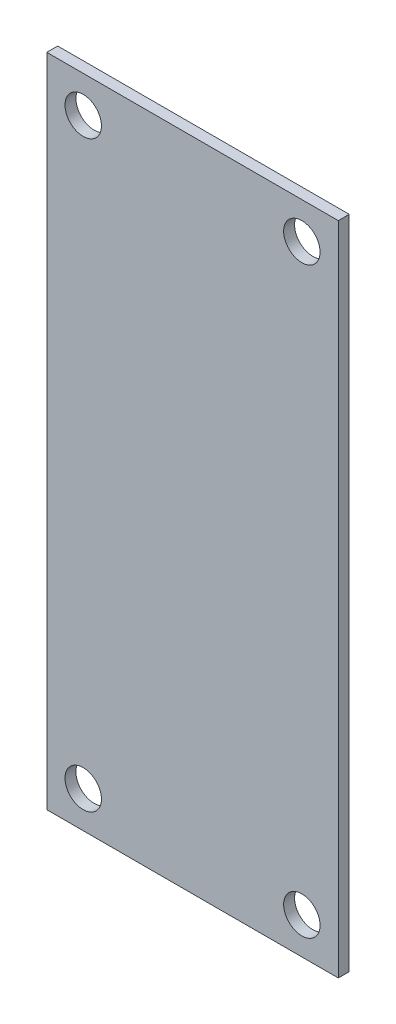
ISO-10303-21;
HEADER;
FILE_DESCRIPTION(('STEP AP214'),'2;1');
FILE_NAME('part.step','',(''),(''),'','','');
FILE_SCHEMA(('AUTOMOTIVE_DESIGN { 1 0 10303 214 1 1 1 1 }'));
ENDSEC;
DATA;
#1=APPLICATION_CONTEXT('core data for automotive mechanical design processes');
#2=APPLICATION_PROTOCOL_DEFINITION('international standard','automotive_design',2000,#1);
#3=PRODUCT_CONTEXT('',#1,'mechanical');
#4=PRODUCT('Part','Part','',(#3));
#5=PRODUCT_RELATED_PRODUCT_CATEGORY('part','',(#4));
#6=PRODUCT_DEFINITION_FORMATION('','',#4);
#7=PRODUCT_DEFINITION_CONTEXT('part definition',#1,'design');
#8=PRODUCT_DEFINITION('design','',#6,#7);
#9=PRODUCT_DEFINITION_SHAPE('','',#8);
#10=(LENGTH_UNIT() NAMED_UNIT(*) SI_UNIT(.MILLI.,.METRE.));
#11=(NAMED_UNIT(*) PLANE_ANGLE_UNIT() SI_UNIT($,.RADIAN.));
#12=(NAMED_UNIT(*) SI_UNIT($,.STERADIAN.) SOLID_ANGLE_UNIT());
#13=UNCERTAINTY_MEASURE_WITH_UNIT(LENGTH_MEASURE(1.E-05),#10,'distance_accuracy_value','');
#14=(GEOMETRIC_REPRESENTATION_CONTEXT(3) GLOBAL_UNCERTAINTY_ASSIGNED_CONTEXT((#13)) GLOBAL_UNIT_ASSIGNED_CONTEXT((#10,
#11,#12)) REPRESENTATION_CONTEXT('',''));
#15=CARTESIAN_POINT('',(0.,0.,0.));
#16=DIRECTION('',(0.,0.,1.));
#17=DIRECTION('',(1.,0.,0.));
#18=AXIS2_PLACEMENT_3D('',#15,#16,#17);
#19=CARTESIAN_POINT('',(-20.,0.,1.5));
#20=DIRECTION('',(1.,0.,0.));
#21=DIRECTION('',(0.,0.,-1.));
#22=AXIS2_PLACEMENT_3D('',#19,#20,#21);
#23=PLANE('',#22);
#24=DIRECTION('',(0.,-1.,0.));
#25=VECTOR('',#24,1.);
#26=CARTESIAN_POINT('',(-20.,0.,0.));
#27=LINE('',#26,#25);
#28=CARTESIAN_POINT('',(-20.,269.,0.));
#29=VERTEX_POINT('',#28);
#30=CARTESIAN_POINT('',(-20.,179.,0.));
#31=VERTEX_POINT('',#30);
#32=EDGE_CURVE('E102',#29,#31,#27,.T.);
#33=ORIENTED_EDGE('',*,*,#32,.T.);
#34=DIRECTION('',(0.,0.,-1.));
#35=VECTOR('',#34,1.);
#36=CARTESIAN_POINT('',(-20.,179.,1.5));
#37=LINE('',#36,#35);
#38=CARTESIAN_POINT('',(-20.,179.,1.5));
#39=VERTEX_POINT('',#38);
#40=EDGE_CURVE('E11',#39,#31,#37,.T.);
#41=ORIENTED_EDGE('',*,*,#40,.F.);
#42=DIRECTION('',(0.,-1.,0.));
#43=VECTOR('',#42,1.);
#44=CARTESIAN_POINT('',(-20.,0.,1.5));
#45=LINE('',#44,#43);
#46=CARTESIAN_POINT('',(-20.,269.,1.5));
#47=VERTEX_POINT('',#46);
#48=EDGE_CURVE('E88',#47,#39,#45,.T.);
#49=ORIENTED_EDGE('',*,*,#48,.F.);
#50=DIRECTION('',(0.,0.,-1.));
#51=VECTOR('',#50,1.);
#52=CARTESIAN_POINT('',(-20.,269.,1.5));
#53=LINE('',#52,#51);
#54=EDGE_CURVE('E55',#47,#29,#53,.T.);
#55=ORIENTED_EDGE('',*,*,#54,.T.);
#56=EDGE_LOOP('',(#33,#41,#49,#55));
#57=FACE_BOUND('',#56,.T.);
#58=ADVANCED_FACE('F39',(#57),#23,.F.);
#59=CARTESIAN_POINT('',(0.,179.,1.5));
#60=DIRECTION('',(0.,1.,0.));
#61=DIRECTION('',(0.,0.,1.));
#62=AXIS2_PLACEMENT_3D('',#59,#60,#61);
#63=PLANE('',#62);
#64=DIRECTION('',(1.,0.,0.));
#65=VECTOR('',#64,1.);
#66=CARTESIAN_POINT('',(0.,179.,0.));
#67=LINE('',#66,#65);
#68=CARTESIAN_POINT('',(20.,179.,0.));
#69=VERTEX_POINT('',#68);
#70=EDGE_CURVE('E93',#31,#69,#67,.T.);
#71=ORIENTED_EDGE('',*,*,#70,.T.);
#72=DIRECTION('',(0.,0.,-1.));
#73=VECTOR('',#72,1.);
#74=CARTESIAN_POINT('',(20.,179.,1.5));
#75=LINE('',#74,#73);
#76=CARTESIAN_POINT('',(20.,179.,1.5));
#77=VERTEX_POINT('',#76);
#78=EDGE_CURVE('E47',#77,#69,#75,.T.);
#79=ORIENTED_EDGE('',*,*,#78,.F.);
#80=DIRECTION('',(1.,0.,0.));
#81=VECTOR('',#80,1.);
#82=CARTESIAN_POINT('',(0.,179.,1.5));
#83=LINE('',#82,#81);
#84=EDGE_CURVE('E80',#39,#77,#83,.T.);
#85=ORIENTED_EDGE('',*,*,#84,.F.);
#86=ORIENTED_EDGE('',*,*,#40,.T.);
#87=EDGE_LOOP('',(#71,#79,#85,#86));
#88=FACE_BOUND('',#87,.T.);
#89=ADVANCED_FACE('F92',(#88),#63,.F.);
#90=CARTESIAN_POINT('',(20.,0.,1.5));
#91=DIRECTION('',(1.,0.,0.));
#92=DIRECTION('',(0.,0.,-1.));
#93=AXIS2_PLACEMENT_3D('',#90,#91,#92);
#94=PLANE('',#93);
#95=DIRECTION('',(0.,-1.,0.));
#96=VECTOR('',#95,1.);
#97=CARTESIAN_POINT('',(20.,0.,0.));
#98=LINE('',#97,#96);
#99=CARTESIAN_POINT('',(20.,269.,0.));
#100=VERTEX_POINT('',#99);
#101=EDGE_CURVE('E106',#100,#69,#98,.T.);
#102=ORIENTED_EDGE('',*,*,#101,.F.);
#103=DIRECTION('',(0.,0.,-1.));
#104=VECTOR('',#103,1.);
#105=CARTESIAN_POINT('',(20.,269.,1.5));
#106=LINE('',#105,#104);
#107=CARTESIAN_POINT('',(20.,269.,1.5));
#108=VERTEX_POINT('',#107);
#109=EDGE_CURVE('E69',#108,#100,#106,.T.);
#110=ORIENTED_EDGE('',*,*,#109,.F.);
#111=DIRECTION('',(0.,-1.,0.));
#112=VECTOR('',#111,1.);
#113=CARTESIAN_POINT('',(20.,0.,1.5));
#114=LINE('',#113,#112);
#115=EDGE_CURVE('E87',#108,#77,#114,.T.);
#116=ORIENTED_EDGE('',*,*,#115,.T.);
#117=ORIENTED_EDGE('',*,*,#78,.T.);
#118=EDGE_LOOP('',(#102,#110,#116,#117));
#119=FACE_BOUND('',#118,.T.);
#120=ADVANCED_FACE('F96',(#119),#94,.T.);
#121=CARTESIAN_POINT('',(0.,269.,1.5));
#122=DIRECTION('',(0.,1.,0.));
#123=DIRECTION('',(0.,0.,1.));
#124=AXIS2_PLACEMENT_3D('',#121,#122,#123);
#125=PLANE('',#124);
#126=DIRECTION('',(1.,0.,0.));
#127=VECTOR('',#126,1.);
#128=CARTESIAN_POINT('',(0.,269.,0.));
#129=LINE('',#128,#127);
#130=EDGE_CURVE('E108',#29,#100,#129,.T.);
#131=ORIENTED_EDGE('',*,*,#130,.F.);
#132=ORIENTED_EDGE('',*,*,#54,.F.);
#133=DIRECTION('',(1.,0.,0.));
#134=VECTOR('',#133,1.);
#135=CARTESIAN_POINT('',(0.,269.,1.5));
#136=LINE('',#135,#134);
#137=EDGE_CURVE('E97',#47,#108,#136,.T.);
#138=ORIENTED_EDGE('',*,*,#137,.T.);
#139=ORIENTED_EDGE('',*,*,#109,.T.);
#140=EDGE_LOOP('',(#131,#132,#138,#139));
#141=FACE_BOUND('',#140,.T.);
#142=ADVANCED_FACE('F143',(#141),#125,.T.);
#143=CARTESIAN_POINT('',(0.,0.,1.5));
#144=DIRECTION('',(0.,0.,1.));
#145=DIRECTION('',(1.,0.,0.));
#146=AXIS2_PLACEMENT_3D('',#143,#144,#145);
#147=PLANE('',#146);
#148=CARTESIAN_POINT('',(-15.,264.,1.5));
#149=DIRECTION('',(0.,0.,1.));
#150=DIRECTION('',(-1.,0.,0.));
#151=AXIS2_PLACEMENT_3D('',#148,#149,#150);
#152=CIRCLE('',#151,2.5);
#153=CARTESIAN_POINT('',(-17.5,264.,1.5));
#154=VERTEX_POINT('',#153);
#155=EDGE_CURVE('E123',#154,#154,#152,.T.);
#156=ORIENTED_EDGE('',*,*,#155,.F.);
#157=EDGE_LOOP('',(#156));
#158=FACE_BOUND('',#157,.T.);
#159=CARTESIAN_POINT('',(-15.,184.,1.5));
#160=DIRECTION('',(0.,0.,1.));
#161=DIRECTION('',(1.,0.,0.));
#162=AXIS2_PLACEMENT_3D('',#159,#160,#161);
#163=CIRCLE('',#162,2.5);
#164=CARTESIAN_POINT('',(-12.5,184.,1.5));
#165=VERTEX_POINT('',#164);
#166=EDGE_CURVE('E129',#165,#165,#163,.T.);
#167=ORIENTED_EDGE('',*,*,#166,.F.);
#168=EDGE_LOOP('',(#167));
#169=FACE_BOUND('',#168,.T.);
#170=CARTESIAN_POINT('',(15.,184.,1.5));
#171=DIRECTION('',(0.,0.,1.));
#172=DIRECTION('',(-1.,0.,0.));
#173=AXIS2_PLACEMENT_3D('',#170,#171,#172);
#174=CIRCLE('',#173,2.5);
#175=CARTESIAN_POINT('',(12.5,184.,1.5));
#176=VERTEX_POINT('',#175);
#177=EDGE_CURVE('E117',#176,#176,#174,.T.);
#178=ORIENTED_EDGE('',*,*,#177,.F.);
#179=EDGE_LOOP('',(#178));
#180=FACE_BOUND('',#179,.T.);
#181=CARTESIAN_POINT('',(15.,264.,1.5));
#182=DIRECTION('',(0.,0.,1.));
#183=DIRECTION('',(1.,0.,0.));
#184=AXIS2_PLACEMENT_3D('',#181,#182,#183);
#185=CIRCLE('',#184,2.5);
#186=CARTESIAN_POINT('',(17.5,264.,1.5));
#187=VERTEX_POINT('',#186);
#188=EDGE_CURVE('E114',#187,#187,#185,.T.);
#189=ORIENTED_EDGE('',*,*,#188,.F.);
#190=EDGE_LOOP('',(#189));
#191=FACE_BOUND('',#190,.T.);
#192=ORIENTED_EDGE('',*,*,#48,.T.);
#193=ORIENTED_EDGE('',*,*,#84,.T.);
#194=ORIENTED_EDGE('',*,*,#115,.F.);
#195=ORIENTED_EDGE('',*,*,#137,.F.);
#196=EDGE_LOOP('',(#192,#193,#194,#195));
#197=FACE_BOUND('',#196,.T.);
#198=ADVANCED_FACE('F84',(#158,#169,#180,#191,#197),#147,.T.);
#199=CARTESIAN_POINT('',(0.,0.,0.));
#200=DIRECTION('',(0.,0.,1.));
#201=DIRECTION('',(1.,0.,0.));
#202=AXIS2_PLACEMENT_3D('',#199,#200,#201);
#203=PLANE('',#202);
#204=CARTESIAN_POINT('',(-15.,264.,0.));
#205=DIRECTION('',(0.,0.,1.));
#206=DIRECTION('',(-1.,0.,0.));
#207=AXIS2_PLACEMENT_3D('',#204,#205,#206);
#208=CIRCLE('',#207,2.5);
#209=CARTESIAN_POINT('',(-17.5,264.,0.));
#210=VERTEX_POINT('',#209);
#211=EDGE_CURVE('E120',#210,#210,#208,.T.);
#212=ORIENTED_EDGE('',*,*,#211,.T.);
#213=EDGE_LOOP('',(#212));
#214=FACE_BOUND('',#213,.T.);
#215=CARTESIAN_POINT('',(-15.,184.,0.));
#216=DIRECTION('',(0.,0.,1.));
#217=DIRECTION('',(1.,0.,0.));
#218=AXIS2_PLACEMENT_3D('',#215,#216,#217);
#219=CIRCLE('',#218,2.5);
#220=CARTESIAN_POINT('',(-12.5,184.,0.));
#221=VERTEX_POINT('',#220);
#222=EDGE_CURVE('E126',#221,#221,#219,.T.);
#223=ORIENTED_EDGE('',*,*,#222,.T.);
#224=EDGE_LOOP('',(#223));
#225=FACE_BOUND('',#224,.T.);
#226=CARTESIAN_POINT('',(15.,184.,0.));
#227=DIRECTION('',(0.,0.,1.));
#228=DIRECTION('',(-1.,0.,0.));
#229=AXIS2_PLACEMENT_3D('',#226,#227,#228);
#230=CIRCLE('',#229,2.5);
#231=CARTESIAN_POINT('',(12.5,184.,0.));
#232=VERTEX_POINT('',#231);
#233=EDGE_CURVE('E132',#232,#232,#230,.T.);
#234=ORIENTED_EDGE('',*,*,#233,.T.);
#235=EDGE_LOOP('',(#234));
#236=FACE_BOUND('',#235,.T.);
#237=CARTESIAN_POINT('',(15.,264.,0.));
#238=DIRECTION('',(0.,0.,1.));
#239=DIRECTION('',(1.,0.,0.));
#240=AXIS2_PLACEMENT_3D('',#237,#238,#239);
#241=CIRCLE('',#240,2.5);
#242=CARTESIAN_POINT('',(17.5,264.,0.));
#243=VERTEX_POINT('',#242);
#244=EDGE_CURVE('E104',#243,#243,#241,.T.);
#245=ORIENTED_EDGE('',*,*,#244,.T.);
#246=EDGE_LOOP('',(#245));
#247=FACE_BOUND('',#246,.T.);
#248=ORIENTED_EDGE('',*,*,#32,.F.);
#249=ORIENTED_EDGE('',*,*,#130,.T.);
#250=ORIENTED_EDGE('',*,*,#101,.T.);
#251=ORIENTED_EDGE('',*,*,#70,.F.);
#252=EDGE_LOOP('',(#248,#249,#250,#251));
#253=FACE_BOUND('',#252,.T.);
#254=ADVANCED_FACE('F142',(#214,#225,#236,#247,#253),#203,.F.);
#255=CARTESIAN_POINT('',(15.,264.,0.));
#256=DIRECTION('',(0.,0.,1.));
#257=DIRECTION('',(1.,0.,0.));
#258=AXIS2_PLACEMENT_3D('',#255,#256,#257);
#259=CYLINDRICAL_SURFACE('',#258,2.5);
#260=ORIENTED_EDGE('',*,*,#244,.F.);
#261=EDGE_LOOP('',(#260));
#262=FACE_BOUND('',#261,.T.);
#263=ORIENTED_EDGE('',*,*,#188,.T.);
#264=EDGE_LOOP('',(#263));
#265=FACE_BOUND('',#264,.T.);
#266=ADVANCED_FACE('F148',(#262,#265),#259,.F.);
#267=CARTESIAN_POINT('',(15.,184.,0.));
#268=DIRECTION('',(0.,0.,1.));
#269=DIRECTION('',(1.,0.,0.));
#270=AXIS2_PLACEMENT_3D('',#267,#268,#269);
#271=CYLINDRICAL_SURFACE('',#270,2.5);
#272=ORIENTED_EDGE('',*,*,#233,.F.);
#273=EDGE_LOOP('',(#272));
#274=FACE_BOUND('',#273,.T.);
#275=ORIENTED_EDGE('',*,*,#177,.T.);
#276=EDGE_LOOP('',(#275));
#277=FACE_BOUND('',#276,.T.);
#278=ADVANCED_FACE('F138',(#274,#277),#271,.F.);
#279=CARTESIAN_POINT('',(-15.,184.,0.));
#280=DIRECTION('',(0.,0.,1.));
#281=DIRECTION('',(1.,0.,0.));
#282=AXIS2_PLACEMENT_3D('',#279,#280,#281);
#283=CYLINDRICAL_SURFACE('',#282,2.5);
#284=ORIENTED_EDGE('',*,*,#222,.F.);
#285=EDGE_LOOP('',(#284));
#286=FACE_BOUND('',#285,.T.);
#287=ORIENTED_EDGE('',*,*,#166,.T.);
#288=EDGE_LOOP('',(#287));
#289=FACE_BOUND('',#288,.T.);
#290=ADVANCED_FACE('F156',(#286,#289),#283,.F.);
#291=CARTESIAN_POINT('',(-15.,264.,0.));
#292=DIRECTION('',(0.,0.,1.));
#293=DIRECTION('',(1.,0.,0.));
#294=AXIS2_PLACEMENT_3D('',#291,#292,#293);
#295=CYLINDRICAL_SURFACE('',#294,2.5);
#296=ORIENTED_EDGE('',*,*,#211,.F.);
#297=EDGE_LOOP('',(#296));
#298=FACE_BOUND('',#297,.T.);
#299=ORIENTED_EDGE('',*,*,#155,.T.);
#300=EDGE_LOOP('',(#299));
#301=FACE_BOUND('',#300,.T.);
#302=ADVANCED_FACE('F237',(#298,#301),#295,.F.);
#303=CLOSED_SHELL('',(#58,#89,#120,#142,#198,#254,#266,#278,#290,#302));
#304=MANIFOLD_SOLID_BREP('B2',#303);
#305=ADVANCED_BREP_SHAPE_REPRESENTATION('',(#18,#304),#14);
#306=SHAPE_DEFINITION_REPRESENTATION(#9,#305);
ENDSEC;
END-ISO-10303-21;
